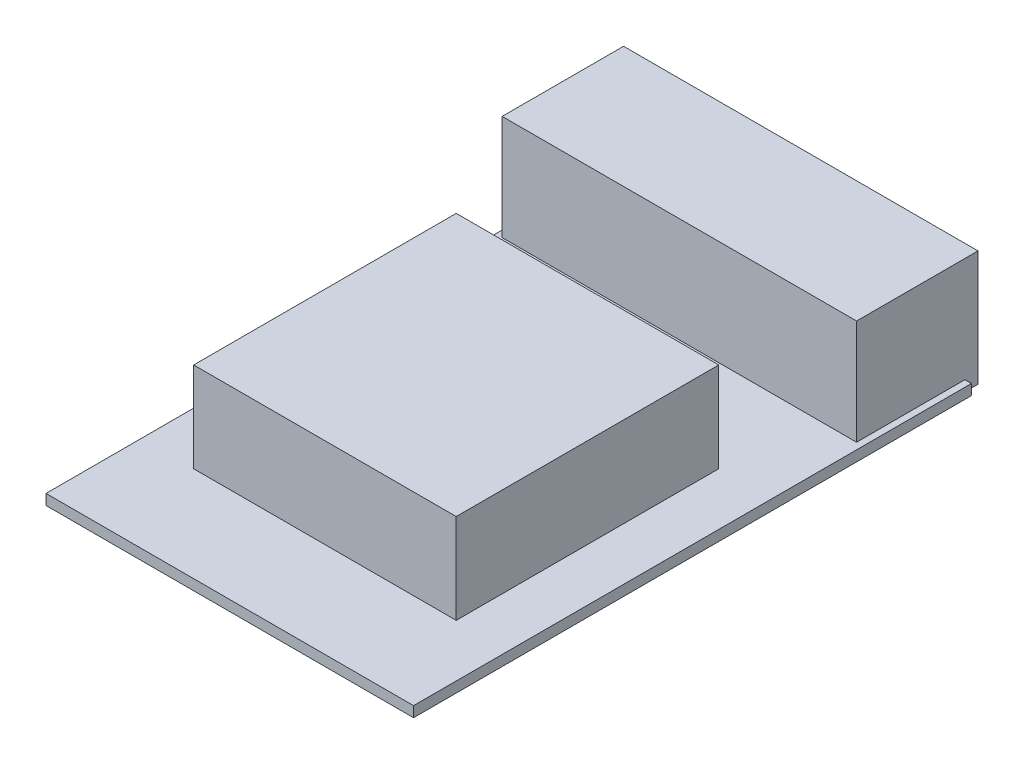
ISO-10303-21;
HEADER;
FILE_DESCRIPTION(('STEP AP214'),'2;1');
FILE_NAME('part.step','',(''),(''),'','','');
FILE_SCHEMA(('AUTOMOTIVE_DESIGN { 1 0 10303 214 1 1 1 1 }'));
ENDSEC;
DATA;
#1=APPLICATION_CONTEXT('core data for automotive mechanical design processes');
#2=APPLICATION_PROTOCOL_DEFINITION('international standard','automotive_design',2000,#1);
#3=PRODUCT_CONTEXT('',#1,'mechanical');
#4=PRODUCT('Part','Part','',(#3));
#5=PRODUCT_RELATED_PRODUCT_CATEGORY('part','',(#4));
#6=PRODUCT_DEFINITION_FORMATION('','',#4);
#7=PRODUCT_DEFINITION_CONTEXT('part definition',#1,'design');
#8=PRODUCT_DEFINITION('design','',#6,#7);
#9=PRODUCT_DEFINITION_SHAPE('','',#8);
#10=(LENGTH_UNIT() NAMED_UNIT(*) SI_UNIT(.MILLI.,.METRE.));
#11=(NAMED_UNIT(*) PLANE_ANGLE_UNIT() SI_UNIT($,.RADIAN.));
#12=(NAMED_UNIT(*) SI_UNIT($,.STERADIAN.) SOLID_ANGLE_UNIT());
#13=UNCERTAINTY_MEASURE_WITH_UNIT(LENGTH_MEASURE(1.E-05),#10,'distance_accuracy_value','');
#14=(GEOMETRIC_REPRESENTATION_CONTEXT(3) GLOBAL_UNCERTAINTY_ASSIGNED_CONTEXT((#13)) GLOBAL_UNIT_ASSIGNED_CONTEXT((#10,
#11,#12)) REPRESENTATION_CONTEXT('',''));
#15=CARTESIAN_POINT('',(0.,0.,0.));
#16=DIRECTION('',(0.,0.,1.));
#17=DIRECTION('',(1.,0.,0.));
#18=AXIS2_PLACEMENT_3D('',#15,#16,#17);
#19=CARTESIAN_POINT('',(0.,1.6,0.));
#20=DIRECTION('',(0.,1.,0.));
#21=DIRECTION('',(0.,0.,1.));
#22=AXIS2_PLACEMENT_3D('',#19,#20,#21);
#23=PLANE('',#22);
#24=DIRECTION('',(-1.,0.,0.));
#25=VECTOR('',#24,1.);
#26=CARTESIAN_POINT('',(0.,1.6,-26.));
#27=LINE('',#26,#25);
#28=CARTESIAN_POINT('',(-71.,1.6,-26.));
#29=VERTEX_POINT('',#28);
#30=CARTESIAN_POINT('',(-125.,1.6,-26.));
#31=VERTEX_POINT('',#30);
#32=EDGE_CURVE('E208',#29,#31,#27,.T.);
#33=ORIENTED_EDGE('',*,*,#32,.T.);
#34=DIRECTION('',(0.,0.,-1.));
#35=VECTOR('',#34,1.);
#36=CARTESIAN_POINT('',(-125.,1.6,0.));
#37=LINE('',#36,#35);
#38=CARTESIAN_POINT('',(-125.,1.6,-42.5));
#39=VERTEX_POINT('',#38);
#40=EDGE_CURVE('E211',#31,#39,#37,.T.);
#41=ORIENTED_EDGE('',*,*,#40,.T.);
#42=DIRECTION('',(-1.,0.,0.));
#43=VECTOR('',#42,1.);
#44=CARTESIAN_POINT('',(-126.,1.6,-42.5));
#45=LINE('',#44,#43);
#46=CARTESIAN_POINT('',(-126.,1.6,-42.5));
#47=VERTEX_POINT('',#46);
#48=EDGE_CURVE('E225',#39,#47,#45,.T.);
#49=ORIENTED_EDGE('',*,*,#48,.T.);
#50=DIRECTION('',(0.,0.,1.));
#51=VECTOR('',#50,1.);
#52=CARTESIAN_POINT('',(-126.,1.6,-42.5));
#53=LINE('',#52,#51);
#54=CARTESIAN_POINT('',(-126.,1.6,42.5));
#55=VERTEX_POINT('',#54);
#56=EDGE_CURVE('E217',#47,#55,#53,.T.);
#57=ORIENTED_EDGE('',*,*,#56,.T.);
#58=DIRECTION('',(1.,0.,0.));
#59=VECTOR('',#58,1.);
#60=CARTESIAN_POINT('',(-126.,1.6,42.5));
#61=LINE('',#60,#59);
#62=CARTESIAN_POINT('',(-70.,1.6,42.5));
#63=VERTEX_POINT('',#62);
#64=EDGE_CURVE('E220',#55,#63,#61,.T.);
#65=ORIENTED_EDGE('',*,*,#64,.T.);
#66=DIRECTION('',(0.,0.,-1.));
#67=VECTOR('',#66,1.);
#68=CARTESIAN_POINT('',(-70.,1.6,-42.5));
#69=LINE('',#68,#67);
#70=CARTESIAN_POINT('',(-70.,1.6,-42.5));
#71=VERTEX_POINT('',#70);
#72=EDGE_CURVE('E223',#63,#71,#69,.T.);
#73=ORIENTED_EDGE('',*,*,#72,.T.);
#74=CARTESIAN_POINT('',(-71.,1.6,-42.5));
#75=VERTEX_POINT('',#74);
#76=EDGE_CURVE('E226',#71,#75,#45,.T.);
#77=ORIENTED_EDGE('',*,*,#76,.T.);
#78=DIRECTION('',(0.,0.,1.));
#79=VECTOR('',#78,1.);
#80=CARTESIAN_POINT('',(-71.,1.6,0.));
#81=LINE('',#80,#79);
#82=EDGE_CURVE('E203',#75,#29,#81,.T.);
#83=ORIENTED_EDGE('',*,*,#82,.T.);
#84=EDGE_LOOP('',(#33,#41,#49,#57,#65,#73,#77,#83));
#85=FACE_BOUND('',#84,.T.);
#86=DIRECTION('',(-1.,0.,0.));
#87=VECTOR('',#86,1.);
#88=CARTESIAN_POINT('',(0.,1.6,28.));
#89=LINE('',#88,#87);
#90=CARTESIAN_POINT('',(-78.,1.6,28.));
#91=VERTEX_POINT('',#90);
#92=CARTESIAN_POINT('',(-118.,1.6,28.));
#93=VERTEX_POINT('',#92);
#94=EDGE_CURVE('E175',#91,#93,#89,.T.);
#95=ORIENTED_EDGE('',*,*,#94,.T.);
#96=DIRECTION('',(0.,0.,-1.));
#97=VECTOR('',#96,1.);
#98=CARTESIAN_POINT('',(-118.,1.6,0.));
#99=LINE('',#98,#97);
#100=CARTESIAN_POINT('',(-118.,1.6,-12.));
#101=VERTEX_POINT('',#100);
#102=EDGE_CURVE('E164',#93,#101,#99,.T.);
#103=ORIENTED_EDGE('',*,*,#102,.T.);
#104=DIRECTION('',(1.,0.,0.));
#105=VECTOR('',#104,1.);
#106=CARTESIAN_POINT('',(0.,1.6,-12.));
#107=LINE('',#106,#105);
#108=CARTESIAN_POINT('',(-78.,1.6,-12.));
#109=VERTEX_POINT('',#108);
#110=EDGE_CURVE('E165',#101,#109,#107,.T.);
#111=ORIENTED_EDGE('',*,*,#110,.T.);
#112=DIRECTION('',(0.,0.,1.));
#113=VECTOR('',#112,1.);
#114=CARTESIAN_POINT('',(-78.,1.6,0.));
#115=LINE('',#114,#113);
#116=EDGE_CURVE('E168',#109,#91,#115,.T.);
#117=ORIENTED_EDGE('',*,*,#116,.T.);
#118=EDGE_LOOP('',(#95,#103,#111,#117));
#119=FACE_BOUND('',#118,.T.);
#120=ADVANCED_FACE('F39',(#85,#119),#23,.T.);
#121=CARTESIAN_POINT('',(-126.,1.6,-42.5));
#122=DIRECTION('',(0.,0.,1.));
#123=DIRECTION('',(1.,0.,0.));
#124=AXIS2_PLACEMENT_3D('',#121,#122,#123);
#125=PLANE('',#124);
#126=DIRECTION('',(0.,1.,0.));
#127=VECTOR('',#126,1.);
#128=CARTESIAN_POINT('',(-125.,1.6,-42.5));
#129=LINE('',#128,#127);
#130=CARTESIAN_POINT('',(-125.,0.,-42.5));
#131=VERTEX_POINT('',#130);
#132=EDGE_CURVE('E214',#131,#39,#129,.T.);
#133=ORIENTED_EDGE('',*,*,#132,.F.);
#134=DIRECTION('',(-1.,0.,0.));
#135=VECTOR('',#134,1.);
#136=CARTESIAN_POINT('',(-126.,0.,-42.5));
#137=LINE('',#136,#135);
#138=CARTESIAN_POINT('',(-126.,0.,-42.5));
#139=VERTEX_POINT('',#138);
#140=EDGE_CURVE('E236',#131,#139,#137,.T.);
#141=ORIENTED_EDGE('',*,*,#140,.T.);
#142=DIRECTION('',(0.,-1.,0.));
#143=VECTOR('',#142,1.);
#144=CARTESIAN_POINT('',(-126.,1.6,-42.5));
#145=LINE('',#144,#143);
#146=EDGE_CURVE('E229',#47,#139,#145,.T.);
#147=ORIENTED_EDGE('',*,*,#146,.F.);
#148=ORIENTED_EDGE('',*,*,#48,.F.);
#149=EDGE_LOOP('',(#133,#141,#147,#148));
#150=FACE_BOUND('',#149,.T.);
#151=ADVANCED_FACE('F272',(#150),#125,.F.);
#152=DIRECTION('',(0.,-1.,0.));
#153=VECTOR('',#152,1.);
#154=CARTESIAN_POINT('',(-71.,1.6,-42.5));
#155=LINE('',#154,#153);
#156=CARTESIAN_POINT('',(-71.,0.,-42.5));
#157=VERTEX_POINT('',#156);
#158=EDGE_CURVE('E206',#75,#157,#155,.T.);
#159=ORIENTED_EDGE('',*,*,#158,.F.);
#160=ORIENTED_EDGE('',*,*,#76,.F.);
#161=DIRECTION('',(0.,-1.,0.));
#162=VECTOR('',#161,1.);
#163=CARTESIAN_POINT('',(-70.,1.6,-42.5));
#164=LINE('',#163,#162);
#165=CARTESIAN_POINT('',(-70.,0.,-42.5));
#166=VERTEX_POINT('',#165);
#167=EDGE_CURVE('E241',#71,#166,#164,.T.);
#168=ORIENTED_EDGE('',*,*,#167,.T.);
#169=EDGE_CURVE('E221',#166,#157,#137,.T.);
#170=ORIENTED_EDGE('',*,*,#169,.T.);
#171=EDGE_LOOP('',(#159,#160,#168,#170));
#172=FACE_BOUND('',#171,.T.);
#173=ADVANCED_FACE('F260',(#172),#125,.F.);
#174=CARTESIAN_POINT('',(-126.,1.6,-42.5));
#175=DIRECTION('',(1.,0.,0.));
#176=DIRECTION('',(0.,0.,-1.));
#177=AXIS2_PLACEMENT_3D('',#174,#175,#176);
#178=PLANE('',#177);
#179=DIRECTION('',(0.,0.,1.));
#180=VECTOR('',#179,1.);
#181=CARTESIAN_POINT('',(-126.,0.,-42.5));
#182=LINE('',#181,#180);
#183=CARTESIAN_POINT('',(-126.,0.,42.5));
#184=VERTEX_POINT('',#183);
#185=EDGE_CURVE('E216',#139,#184,#182,.T.);
#186=ORIENTED_EDGE('',*,*,#185,.T.);
#187=DIRECTION('',(0.,-1.,0.));
#188=VECTOR('',#187,1.);
#189=CARTESIAN_POINT('',(-126.,1.6,42.5));
#190=LINE('',#189,#188);
#191=EDGE_CURVE('E11',#55,#184,#190,.T.);
#192=ORIENTED_EDGE('',*,*,#191,.F.);
#193=ORIENTED_EDGE('',*,*,#56,.F.);
#194=ORIENTED_EDGE('',*,*,#146,.T.);
#195=EDGE_LOOP('',(#186,#192,#193,#194));
#196=FACE_BOUND('',#195,.T.);
#197=ADVANCED_FACE('F41',(#196),#178,.F.);
#198=CARTESIAN_POINT('',(-126.,1.6,42.5));
#199=DIRECTION('',(0.,0.,-1.));
#200=DIRECTION('',(-1.,0.,0.));
#201=AXIS2_PLACEMENT_3D('',#198,#199,#200);
#202=PLANE('',#201);
#203=DIRECTION('',(1.,0.,0.));
#204=VECTOR('',#203,1.);
#205=CARTESIAN_POINT('',(-126.,0.,42.5));
#206=LINE('',#205,#204);
#207=CARTESIAN_POINT('',(-70.,0.,42.5));
#208=VERTEX_POINT('',#207);
#209=EDGE_CURVE('E232',#184,#208,#206,.T.);
#210=ORIENTED_EDGE('',*,*,#209,.T.);
#211=DIRECTION('',(0.,-1.,0.));
#212=VECTOR('',#211,1.);
#213=CARTESIAN_POINT('',(-70.,1.6,42.5));
#214=LINE('',#213,#212);
#215=EDGE_CURVE('E47',#63,#208,#214,.T.);
#216=ORIENTED_EDGE('',*,*,#215,.F.);
#217=ORIENTED_EDGE('',*,*,#64,.F.);
#218=ORIENTED_EDGE('',*,*,#191,.T.);
#219=EDGE_LOOP('',(#210,#216,#217,#218));
#220=FACE_BOUND('',#219,.T.);
#221=ADVANCED_FACE('F266',(#220),#202,.F.);
#222=CARTESIAN_POINT('',(-70.,1.6,-42.5));
#223=DIRECTION('',(-1.,0.,0.));
#224=DIRECTION('',(0.,0.,1.));
#225=AXIS2_PLACEMENT_3D('',#222,#223,#224);
#226=PLANE('',#225);
#227=DIRECTION('',(0.,0.,-1.));
#228=VECTOR('',#227,1.);
#229=CARTESIAN_POINT('',(-70.,0.,-42.5));
#230=LINE('',#229,#228);
#231=EDGE_CURVE('E234',#208,#166,#230,.T.);
#232=ORIENTED_EDGE('',*,*,#231,.T.);
#233=ORIENTED_EDGE('',*,*,#167,.F.);
#234=ORIENTED_EDGE('',*,*,#72,.F.);
#235=ORIENTED_EDGE('',*,*,#215,.T.);
#236=EDGE_LOOP('',(#232,#233,#234,#235));
#237=FACE_BOUND('',#236,.T.);
#238=ADVANCED_FACE('F248',(#237),#226,.F.);
#239=CARTESIAN_POINT('',(0.,0.,0.));
#240=DIRECTION('',(0.,1.,0.));
#241=DIRECTION('',(0.,0.,1.));
#242=AXIS2_PLACEMENT_3D('',#239,#240,#241);
#243=PLANE('',#242);
#244=ORIENTED_EDGE('',*,*,#140,.F.);
#245=DIRECTION('',(0.,0.,1.));
#246=VECTOR('',#245,1.);
#247=CARTESIAN_POINT('',(-125.,0.,-44.5));
#248=LINE('',#247,#246);
#249=CARTESIAN_POINT('',(-125.,0.,-44.5));
#250=VERTEX_POINT('',#249);
#251=EDGE_CURVE('E178',#250,#131,#248,.T.);
#252=ORIENTED_EDGE('',*,*,#251,.F.);
#253=DIRECTION('',(-1.,0.,0.));
#254=VECTOR('',#253,1.);
#255=CARTESIAN_POINT('',(-125.,0.,-44.5));
#256=LINE('',#255,#254);
#257=CARTESIAN_POINT('',(-71.,0.,-44.5));
#258=VERTEX_POINT('',#257);
#259=EDGE_CURVE('E183',#258,#250,#256,.T.);
#260=ORIENTED_EDGE('',*,*,#259,.F.);
#261=DIRECTION('',(0.,0.,-1.));
#262=VECTOR('',#261,1.);
#263=CARTESIAN_POINT('',(-71.,0.,-44.5));
#264=LINE('',#263,#262);
#265=EDGE_CURVE('E191',#157,#258,#264,.T.);
#266=ORIENTED_EDGE('',*,*,#265,.F.);
#267=ORIENTED_EDGE('',*,*,#169,.F.);
#268=ORIENTED_EDGE('',*,*,#231,.F.);
#269=ORIENTED_EDGE('',*,*,#209,.F.);
#270=ORIENTED_EDGE('',*,*,#185,.F.);
#271=EDGE_LOOP('',(#244,#252,#260,#266,#267,#268,#269,#270));
#272=FACE_BOUND('',#271,.T.);
#273=ADVANCED_FACE('F254',(#272),#243,.F.);
#274=CARTESIAN_POINT('',(-125.,17.6,-44.5));
#275=DIRECTION('',(1.,0.,0.));
#276=DIRECTION('',(0.,0.,-1.));
#277=AXIS2_PLACEMENT_3D('',#274,#275,#276);
#278=PLANE('',#277);
#279=ORIENTED_EDGE('',*,*,#251,.T.);
#280=ORIENTED_EDGE('',*,*,#132,.T.);
#281=ORIENTED_EDGE('',*,*,#40,.F.);
#282=DIRECTION('',(0.,-1.,0.));
#283=VECTOR('',#282,1.);
#284=CARTESIAN_POINT('',(-125.,17.6,-26.));
#285=LINE('',#284,#283);
#286=CARTESIAN_POINT('',(-125.,17.6,-26.));
#287=VERTEX_POINT('',#286);
#288=EDGE_CURVE('E200',#287,#31,#285,.T.);
#289=ORIENTED_EDGE('',*,*,#288,.F.);
#290=DIRECTION('',(0.,0.,1.));
#291=VECTOR('',#290,1.);
#292=CARTESIAN_POINT('',(-125.,17.6,-44.5));
#293=LINE('',#292,#291);
#294=CARTESIAN_POINT('',(-125.,17.6,-44.5));
#295=VERTEX_POINT('',#294);
#296=EDGE_CURVE('E179',#295,#287,#293,.T.);
#297=ORIENTED_EDGE('',*,*,#296,.F.);
#298=DIRECTION('',(0.,-1.,0.));
#299=VECTOR('',#298,1.);
#300=CARTESIAN_POINT('',(-125.,17.6,-44.5));
#301=LINE('',#300,#299);
#302=EDGE_CURVE('E189',#295,#250,#301,.T.);
#303=ORIENTED_EDGE('',*,*,#302,.T.);
#304=EDGE_LOOP('',(#279,#280,#281,#289,#297,#303));
#305=FACE_BOUND('',#304,.T.);
#306=ADVANCED_FACE('F275',(#305),#278,.F.);
#307=CARTESIAN_POINT('',(-71.,17.6,-44.5));
#308=DIRECTION('',(-1.,0.,0.));
#309=DIRECTION('',(0.,0.,1.));
#310=AXIS2_PLACEMENT_3D('',#307,#308,#309);
#311=PLANE('',#310);
#312=ORIENTED_EDGE('',*,*,#82,.F.);
#313=ORIENTED_EDGE('',*,*,#158,.T.);
#314=ORIENTED_EDGE('',*,*,#265,.T.);
#315=DIRECTION('',(0.,-1.,0.));
#316=VECTOR('',#315,1.);
#317=CARTESIAN_POINT('',(-71.,17.6,-44.5));
#318=LINE('',#317,#316);
#319=CARTESIAN_POINT('',(-71.,17.6,-44.5));
#320=VERTEX_POINT('',#319);
#321=EDGE_CURVE('E196',#320,#258,#318,.T.);
#322=ORIENTED_EDGE('',*,*,#321,.F.);
#323=DIRECTION('',(0.,0.,-1.));
#324=VECTOR('',#323,1.);
#325=CARTESIAN_POINT('',(-71.,17.6,-44.5));
#326=LINE('',#325,#324);
#327=CARTESIAN_POINT('',(-71.,17.6,-26.));
#328=VERTEX_POINT('',#327);
#329=EDGE_CURVE('E185',#328,#320,#326,.T.);
#330=ORIENTED_EDGE('',*,*,#329,.F.);
#331=DIRECTION('',(0.,-1.,0.));
#332=VECTOR('',#331,1.);
#333=CARTESIAN_POINT('',(-71.,17.6,-26.));
#334=LINE('',#333,#332);
#335=EDGE_CURVE('E62',#328,#29,#334,.T.);
#336=ORIENTED_EDGE('',*,*,#335,.T.);
#337=EDGE_LOOP('',(#312,#313,#314,#322,#330,#336));
#338=FACE_BOUND('',#337,.T.);
#339=ADVANCED_FACE('F287',(#338),#311,.F.);
#340=CARTESIAN_POINT('',(-125.,17.6,-26.));
#341=DIRECTION('',(0.,0.,-1.));
#342=DIRECTION('',(-1.,0.,0.));
#343=AXIS2_PLACEMENT_3D('',#340,#341,#342);
#344=PLANE('',#343);
#345=ORIENTED_EDGE('',*,*,#32,.F.);
#346=ORIENTED_EDGE('',*,*,#335,.F.);
#347=DIRECTION('',(1.,0.,0.));
#348=VECTOR('',#347,1.);
#349=CARTESIAN_POINT('',(-125.,17.6,-26.));
#350=LINE('',#349,#348);
#351=EDGE_CURVE('E182',#287,#328,#350,.T.);
#352=ORIENTED_EDGE('',*,*,#351,.F.);
#353=ORIENTED_EDGE('',*,*,#288,.T.);
#354=EDGE_LOOP('',(#345,#346,#352,#353));
#355=FACE_BOUND('',#354,.T.);
#356=ADVANCED_FACE('F278',(#355),#344,.F.);
#357=CARTESIAN_POINT('',(-125.,17.6,-44.5));
#358=DIRECTION('',(0.,0.,1.));
#359=DIRECTION('',(1.,0.,0.));
#360=AXIS2_PLACEMENT_3D('',#357,#358,#359);
#361=PLANE('',#360);
#362=ORIENTED_EDGE('',*,*,#259,.T.);
#363=ORIENTED_EDGE('',*,*,#302,.F.);
#364=DIRECTION('',(-1.,0.,0.));
#365=VECTOR('',#364,1.);
#366=CARTESIAN_POINT('',(-125.,17.6,-44.5));
#367=LINE('',#366,#365);
#368=EDGE_CURVE('E187',#320,#295,#367,.T.);
#369=ORIENTED_EDGE('',*,*,#368,.F.);
#370=ORIENTED_EDGE('',*,*,#321,.T.);
#371=EDGE_LOOP('',(#362,#363,#369,#370));
#372=FACE_BOUND('',#371,.T.);
#373=ADVANCED_FACE('F286',(#372),#361,.F.);
#374=CARTESIAN_POINT('',(0.,17.6,0.));
#375=DIRECTION('',(0.,1.,0.));
#376=DIRECTION('',(0.,0.,1.));
#377=AXIS2_PLACEMENT_3D('',#374,#375,#376);
#378=PLANE('',#377);
#379=ORIENTED_EDGE('',*,*,#296,.T.);
#380=ORIENTED_EDGE('',*,*,#351,.T.);
#381=ORIENTED_EDGE('',*,*,#329,.T.);
#382=ORIENTED_EDGE('',*,*,#368,.T.);
#383=EDGE_LOOP('',(#379,#380,#381,#382));
#384=FACE_BOUND('',#383,.T.);
#385=ADVANCED_FACE('F282',(#384),#378,.T.);
#386=CARTESIAN_POINT('',(-118.,15.3,-12.));
#387=DIRECTION('',(1.,0.,0.));
#388=DIRECTION('',(0.,0.,-1.));
#389=AXIS2_PLACEMENT_3D('',#386,#387,#388);
#390=PLANE('',#389);
#391=ORIENTED_EDGE('',*,*,#102,.F.);
#392=DIRECTION('',(0.,-1.,0.));
#393=VECTOR('',#392,1.);
#394=CARTESIAN_POINT('',(-118.,15.3,28.));
#395=LINE('',#394,#393);
#396=CARTESIAN_POINT('',(-118.,15.3,28.));
#397=VERTEX_POINT('',#396);
#398=EDGE_CURVE('E146',#397,#93,#395,.T.);
#399=ORIENTED_EDGE('',*,*,#398,.F.);
#400=DIRECTION('',(0.,0.,1.));
#401=VECTOR('',#400,1.);
#402=CARTESIAN_POINT('',(-118.,15.3,-12.));
#403=LINE('',#402,#401);
#404=CARTESIAN_POINT('',(-118.,15.3,-12.));
#405=VERTEX_POINT('',#404);
#406=EDGE_CURVE('E153',#405,#397,#403,.T.);
#407=ORIENTED_EDGE('',*,*,#406,.F.);
#408=DIRECTION('',(0.,-1.,0.));
#409=VECTOR('',#408,1.);
#410=CARTESIAN_POINT('',(-118.,15.3,-12.));
#411=LINE('',#410,#409);
#412=EDGE_CURVE('E404',#405,#101,#411,.T.);
#413=ORIENTED_EDGE('',*,*,#412,.T.);
#414=EDGE_LOOP('',(#391,#399,#407,#413));
#415=FACE_BOUND('',#414,.T.);
#416=ADVANCED_FACE('F162',(#415),#390,.F.);
#417=CARTESIAN_POINT('',(-118.,15.3,28.));
#418=DIRECTION('',(0.,0.,-1.));
#419=DIRECTION('',(-1.,0.,0.));
#420=AXIS2_PLACEMENT_3D('',#417,#418,#419);
#421=PLANE('',#420);
#422=ORIENTED_EDGE('',*,*,#94,.F.);
#423=DIRECTION('',(0.,-1.,0.));
#424=VECTOR('',#423,1.);
#425=CARTESIAN_POINT('',(-78.,15.3,28.));
#426=LINE('',#425,#424);
#427=CARTESIAN_POINT('',(-78.,15.3,28.));
#428=VERTEX_POINT('',#427);
#429=EDGE_CURVE('E149',#428,#91,#426,.T.);
#430=ORIENTED_EDGE('',*,*,#429,.F.);
#431=DIRECTION('',(1.,0.,0.));
#432=VECTOR('',#431,1.);
#433=CARTESIAN_POINT('',(-118.,15.3,28.));
#434=LINE('',#433,#432);
#435=EDGE_CURVE('E142',#397,#428,#434,.T.);
#436=ORIENTED_EDGE('',*,*,#435,.F.);
#437=ORIENTED_EDGE('',*,*,#398,.T.);
#438=EDGE_LOOP('',(#422,#430,#436,#437));
#439=FACE_BOUND('',#438,.T.);
#440=ADVANCED_FACE('F144',(#439),#421,.F.);
#441=CARTESIAN_POINT('',(-78.,15.3,-12.));
#442=DIRECTION('',(-1.,0.,0.));
#443=DIRECTION('',(0.,0.,1.));
#444=AXIS2_PLACEMENT_3D('',#441,#442,#443);
#445=PLANE('',#444);
#446=ORIENTED_EDGE('',*,*,#116,.F.);
#447=DIRECTION('',(0.,-1.,0.));
#448=VECTOR('',#447,1.);
#449=CARTESIAN_POINT('',(-78.,15.3,-12.));
#450=LINE('',#449,#448);
#451=CARTESIAN_POINT('',(-78.,15.3,-12.));
#452=VERTEX_POINT('',#451);
#453=EDGE_CURVE('E54',#452,#109,#450,.T.);
#454=ORIENTED_EDGE('',*,*,#453,.F.);
#455=DIRECTION('',(0.,0.,-1.));
#456=VECTOR('',#455,1.);
#457=CARTESIAN_POINT('',(-78.,15.3,-12.));
#458=LINE('',#457,#456);
#459=EDGE_CURVE('E152',#428,#452,#458,.T.);
#460=ORIENTED_EDGE('',*,*,#459,.F.);
#461=ORIENTED_EDGE('',*,*,#429,.T.);
#462=EDGE_LOOP('',(#446,#454,#460,#461));
#463=FACE_BOUND('',#462,.T.);
#464=ADVANCED_FACE('F375',(#463),#445,.F.);
#465=CARTESIAN_POINT('',(-118.,15.3,-12.));
#466=DIRECTION('',(0.,0.,1.));
#467=DIRECTION('',(1.,0.,0.));
#468=AXIS2_PLACEMENT_3D('',#465,#466,#467);
#469=PLANE('',#468);
#470=ORIENTED_EDGE('',*,*,#110,.F.);
#471=ORIENTED_EDGE('',*,*,#412,.F.);
#472=DIRECTION('',(-1.,0.,0.));
#473=VECTOR('',#472,1.);
#474=CARTESIAN_POINT('',(-118.,15.3,-12.));
#475=LINE('',#474,#473);
#476=EDGE_CURVE('E157',#452,#405,#475,.T.);
#477=ORIENTED_EDGE('',*,*,#476,.F.);
#478=ORIENTED_EDGE('',*,*,#453,.T.);
#479=EDGE_LOOP('',(#470,#471,#477,#478));
#480=FACE_BOUND('',#479,.T.);
#481=ADVANCED_FACE('F384',(#480),#469,.F.);
#482=CARTESIAN_POINT('',(0.,15.3,0.));
#483=DIRECTION('',(0.,1.,0.));
#484=DIRECTION('',(0.,0.,1.));
#485=AXIS2_PLACEMENT_3D('',#482,#483,#484);
#486=PLANE('',#485);
#487=ORIENTED_EDGE('',*,*,#406,.T.);
#488=ORIENTED_EDGE('',*,*,#435,.T.);
#489=ORIENTED_EDGE('',*,*,#459,.T.);
#490=ORIENTED_EDGE('',*,*,#476,.T.);
#491=EDGE_LOOP('',(#487,#488,#489,#490));
#492=FACE_BOUND('',#491,.T.);
#493=ADVANCED_FACE('F156',(#492),#486,.T.);
#494=CLOSED_SHELL('',(#120,#151,#173,#197,#221,#238,#273,#306,#339,#356,#373,#385,#416,#440,
#464,#481,#493));
#495=MANIFOLD_SOLID_BREP('B2',#494);
#496=ADVANCED_BREP_SHAPE_REPRESENTATION('',(#18,#495),#14);
#497=SHAPE_DEFINITION_REPRESENTATION(#9,#496);
ENDSEC;
END-ISO-10303-21;
